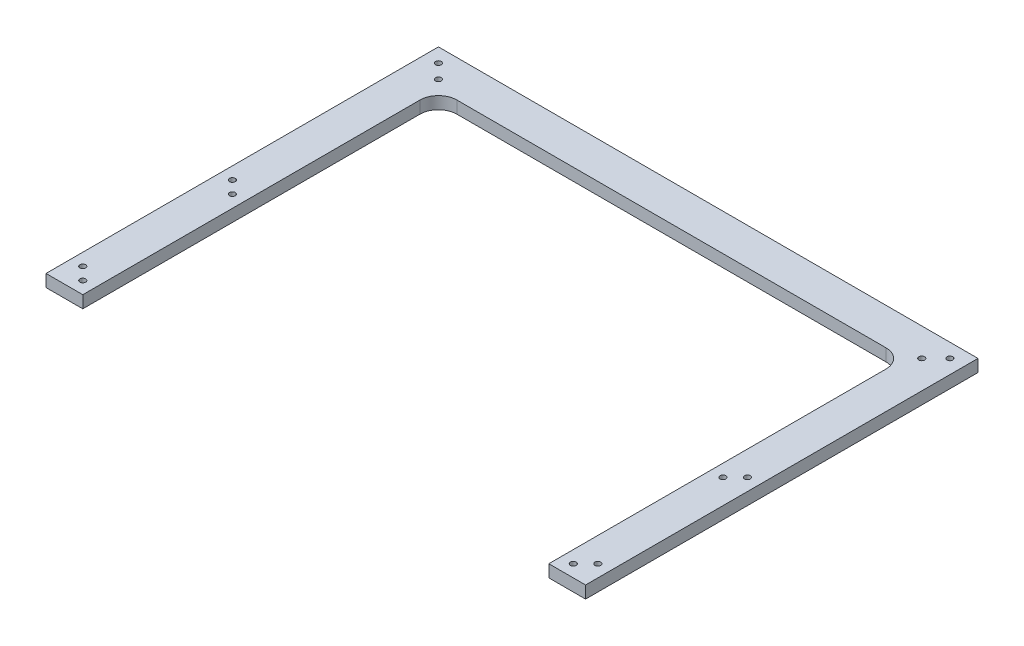
ISO-10303-21;
HEADER;
FILE_DESCRIPTION(('STEP AP214'),'2;1');
FILE_NAME('part.step','',(''),(''),'','','');
FILE_SCHEMA(('AUTOMOTIVE_DESIGN { 1 0 10303 214 1 1 1 1 }'));
ENDSEC;
DATA;
#1=APPLICATION_CONTEXT('core data for automotive mechanical design processes');
#2=APPLICATION_PROTOCOL_DEFINITION('international standard','automotive_design',2000,#1);
#3=PRODUCT_CONTEXT('',#1,'mechanical');
#4=PRODUCT('Part','Part','',(#3));
#5=PRODUCT_RELATED_PRODUCT_CATEGORY('part','',(#4));
#6=PRODUCT_DEFINITION_FORMATION('','',#4);
#7=PRODUCT_DEFINITION_CONTEXT('part definition',#1,'design');
#8=PRODUCT_DEFINITION('design','',#6,#7);
#9=PRODUCT_DEFINITION_SHAPE('','',#8);
#10=(LENGTH_UNIT() NAMED_UNIT(*) SI_UNIT(.MILLI.,.METRE.));
#11=(NAMED_UNIT(*) PLANE_ANGLE_UNIT() SI_UNIT($,.RADIAN.));
#12=(NAMED_UNIT(*) SI_UNIT($,.STERADIAN.) SOLID_ANGLE_UNIT());
#13=UNCERTAINTY_MEASURE_WITH_UNIT(LENGTH_MEASURE(1.E-05),#10,'distance_accuracy_value','');
#14=(GEOMETRIC_REPRESENTATION_CONTEXT(3) GLOBAL_UNCERTAINTY_ASSIGNED_CONTEXT((#13)) GLOBAL_UNIT_ASSIGNED_CONTEXT((#10,
#11,#12)) REPRESENTATION_CONTEXT('',''));
#15=CARTESIAN_POINT('',(0.,0.,0.));
#16=DIRECTION('',(0.,0.,1.));
#17=DIRECTION('',(1.,0.,0.));
#18=AXIS2_PLACEMENT_3D('',#15,#16,#17);
#19=CARTESIAN_POINT('',(-139.7,-6.35,101.6));
#20=DIRECTION('',(0.,0.,1.));
#21=DIRECTION('',(1.,0.,0.));
#22=AXIS2_PLACEMENT_3D('',#19,#20,#21);
#23=PLANE('',#22);
#24=DIRECTION('',(1.,0.,0.));
#25=VECTOR('',#24,1.);
#26=CARTESIAN_POINT('',(-139.7,0.,101.6));
#27=LINE('',#26,#25);
#28=CARTESIAN_POINT('',(-139.7,0.,101.6));
#29=VERTEX_POINT('',#28);
#30=CARTESIAN_POINT('',(-120.65,0.,101.6));
#31=VERTEX_POINT('',#30);
#32=EDGE_CURVE('E167',#29,#31,#27,.T.);
#33=ORIENTED_EDGE('',*,*,#32,.F.);
#34=DIRECTION('',(0.,1.,0.));
#35=VECTOR('',#34,1.);
#36=CARTESIAN_POINT('',(-139.7,-6.35,101.6));
#37=LINE('',#36,#35);
#38=CARTESIAN_POINT('',(-139.7,-6.35,101.6));
#39=VERTEX_POINT('',#38);
#40=EDGE_CURVE('E135',#39,#29,#37,.T.);
#41=ORIENTED_EDGE('',*,*,#40,.F.);
#42=DIRECTION('',(1.,0.,0.));
#43=VECTOR('',#42,1.);
#44=CARTESIAN_POINT('',(-139.7,-6.35,101.6));
#45=LINE('',#44,#43);
#46=CARTESIAN_POINT('',(-120.65,-6.35,101.6));
#47=VERTEX_POINT('',#46);
#48=EDGE_CURVE('E131',#39,#47,#45,.T.);
#49=ORIENTED_EDGE('',*,*,#48,.T.);
#50=DIRECTION('',(0.,1.,0.));
#51=VECTOR('',#50,1.);
#52=CARTESIAN_POINT('',(-120.65,-6.35,101.6));
#53=LINE('',#52,#51);
#54=EDGE_CURVE('E116',#47,#31,#53,.T.);
#55=ORIENTED_EDGE('',*,*,#54,.T.);
#56=EDGE_LOOP('',(#33,#41,#49,#55));
#57=FACE_BOUND('',#56,.T.);
#58=ADVANCED_FACE('F39',(#57),#23,.T.);
#59=CARTESIAN_POINT('',(-139.7,-6.35,101.6));
#60=DIRECTION('',(1.,0.,0.));
#61=DIRECTION('',(0.,0.,-1.));
#62=AXIS2_PLACEMENT_3D('',#59,#60,#61);
#63=PLANE('',#62);
#64=DIRECTION('',(0.,0.,-1.));
#65=VECTOR('',#64,1.);
#66=CARTESIAN_POINT('',(-139.7,0.,101.6));
#67=LINE('',#66,#65);
#68=CARTESIAN_POINT('',(-139.7,0.,-101.6));
#69=VERTEX_POINT('',#68);
#70=EDGE_CURVE('E138',#29,#69,#67,.T.);
#71=ORIENTED_EDGE('',*,*,#70,.T.);
#72=DIRECTION('',(0.,1.,0.));
#73=VECTOR('',#72,1.);
#74=CARTESIAN_POINT('',(-139.7,-6.35,-101.6));
#75=LINE('',#74,#73);
#76=CARTESIAN_POINT('',(-139.7,-6.35,-101.6));
#77=VERTEX_POINT('',#76);
#78=EDGE_CURVE('E195',#77,#69,#75,.T.);
#79=ORIENTED_EDGE('',*,*,#78,.F.);
#80=DIRECTION('',(0.,0.,-1.));
#81=VECTOR('',#80,1.);
#82=CARTESIAN_POINT('',(-139.7,-6.35,101.6));
#83=LINE('',#82,#81);
#84=EDGE_CURVE('E127',#39,#77,#83,.T.);
#85=ORIENTED_EDGE('',*,*,#84,.F.);
#86=ORIENTED_EDGE('',*,*,#40,.T.);
#87=EDGE_LOOP('',(#71,#79,#85,#86));
#88=FACE_BOUND('',#87,.T.);
#89=ADVANCED_FACE('F243',(#88),#63,.F.);
#90=CARTESIAN_POINT('',(-139.7,-6.35,-101.6));
#91=DIRECTION('',(0.,0.,1.));
#92=DIRECTION('',(1.,0.,0.));
#93=AXIS2_PLACEMENT_3D('',#90,#91,#92);
#94=PLANE('',#93);
#95=DIRECTION('',(1.,0.,0.));
#96=VECTOR('',#95,1.);
#97=CARTESIAN_POINT('',(-139.7,0.,-101.6));
#98=LINE('',#97,#96);
#99=CARTESIAN_POINT('',(139.7,0.,-101.6));
#100=VERTEX_POINT('',#99);
#101=EDGE_CURVE('E141',#69,#100,#98,.T.);
#102=ORIENTED_EDGE('',*,*,#101,.T.);
#103=DIRECTION('',(0.,1.,0.));
#104=VECTOR('',#103,1.);
#105=CARTESIAN_POINT('',(139.7,-6.35,-101.6));
#106=LINE('',#105,#104);
#107=CARTESIAN_POINT('',(139.7,-6.35,-101.6));
#108=VERTEX_POINT('',#107);
#109=EDGE_CURVE('E199',#108,#100,#106,.T.);
#110=ORIENTED_EDGE('',*,*,#109,.F.);
#111=DIRECTION('',(1.,0.,0.));
#112=VECTOR('',#111,1.);
#113=CARTESIAN_POINT('',(-139.7,-6.35,-101.6));
#114=LINE('',#113,#112);
#115=EDGE_CURVE('E162',#77,#108,#114,.T.);
#116=ORIENTED_EDGE('',*,*,#115,.F.);
#117=ORIENTED_EDGE('',*,*,#78,.T.);
#118=EDGE_LOOP('',(#102,#110,#116,#117));
#119=FACE_BOUND('',#118,.T.);
#120=ADVANCED_FACE('F248',(#119),#94,.F.);
#121=CARTESIAN_POINT('',(139.7,-6.35,101.6));
#122=DIRECTION('',(1.,0.,0.));
#123=DIRECTION('',(0.,0.,-1.));
#124=AXIS2_PLACEMENT_3D('',#121,#122,#123);
#125=PLANE('',#124);
#126=DIRECTION('',(0.,0.,-1.));
#127=VECTOR('',#126,1.);
#128=CARTESIAN_POINT('',(139.7,0.,101.6));
#129=LINE('',#128,#127);
#130=CARTESIAN_POINT('',(139.7,0.,101.6));
#131=VERTEX_POINT('',#130);
#132=EDGE_CURVE('E185',#131,#100,#129,.T.);
#133=ORIENTED_EDGE('',*,*,#132,.F.);
#134=DIRECTION('',(0.,1.,0.));
#135=VECTOR('',#134,1.);
#136=CARTESIAN_POINT('',(139.7,-6.35,101.6));
#137=LINE('',#136,#135);
#138=CARTESIAN_POINT('',(139.7,-6.35,101.6));
#139=VERTEX_POINT('',#138);
#140=EDGE_CURVE('E202',#139,#131,#137,.T.);
#141=ORIENTED_EDGE('',*,*,#140,.F.);
#142=DIRECTION('',(0.,0.,-1.));
#143=VECTOR('',#142,1.);
#144=CARTESIAN_POINT('',(139.7,-6.35,101.6));
#145=LINE('',#144,#143);
#146=EDGE_CURVE('E158',#139,#108,#145,.T.);
#147=ORIENTED_EDGE('',*,*,#146,.T.);
#148=ORIENTED_EDGE('',*,*,#109,.T.);
#149=EDGE_LOOP('',(#133,#141,#147,#148));
#150=FACE_BOUND('',#149,.T.);
#151=ADVANCED_FACE('F263',(#150),#125,.T.);
#152=CARTESIAN_POINT('',(120.65,-6.35,101.6));
#153=DIRECTION('',(0.,0.,1.));
#154=DIRECTION('',(1.,0.,0.));
#155=AXIS2_PLACEMENT_3D('',#152,#153,#154);
#156=PLANE('',#155);
#157=DIRECTION('',(1.,0.,0.));
#158=VECTOR('',#157,1.);
#159=CARTESIAN_POINT('',(120.65,0.,101.6));
#160=LINE('',#159,#158);
#161=CARTESIAN_POINT('',(120.65,0.,101.6));
#162=VERTEX_POINT('',#161);
#163=EDGE_CURVE('E181',#162,#131,#160,.T.);
#164=ORIENTED_EDGE('',*,*,#163,.F.);
#165=DIRECTION('',(0.,1.,0.));
#166=VECTOR('',#165,1.);
#167=CARTESIAN_POINT('',(120.65,-6.35,101.6));
#168=LINE('',#167,#166);
#169=CARTESIAN_POINT('',(120.65,-6.35,101.6));
#170=VERTEX_POINT('',#169);
#171=EDGE_CURVE('E126',#170,#162,#168,.T.);
#172=ORIENTED_EDGE('',*,*,#171,.F.);
#173=DIRECTION('',(1.,0.,0.));
#174=VECTOR('',#173,1.);
#175=CARTESIAN_POINT('',(120.65,-6.35,101.6));
#176=LINE('',#175,#174);
#177=EDGE_CURVE('E154',#170,#139,#176,.T.);
#178=ORIENTED_EDGE('',*,*,#177,.T.);
#179=ORIENTED_EDGE('',*,*,#140,.T.);
#180=EDGE_LOOP('',(#164,#172,#178,#179));
#181=FACE_BOUND('',#180,.T.);
#182=ADVANCED_FACE('F259',(#181),#156,.T.);
#183=CARTESIAN_POINT('',(120.65,-6.35,101.6));
#184=DIRECTION('',(1.,0.,0.));
#185=DIRECTION('',(0.,0.,-1.));
#186=AXIS2_PLACEMENT_3D('',#183,#184,#185);
#187=PLANE('',#186);
#188=DIRECTION('',(0.,0.,-1.));
#189=VECTOR('',#188,1.);
#190=CARTESIAN_POINT('',(120.65,0.,101.6));
#191=LINE('',#190,#189);
#192=CARTESIAN_POINT('',(120.65,0.,-73.025));
#193=VERTEX_POINT('',#192);
#194=EDGE_CURVE('E177',#162,#193,#191,.T.);
#195=ORIENTED_EDGE('',*,*,#194,.T.);
#196=DIRECTION('',(0.,1.,0.));
#197=VECTOR('',#196,1.);
#198=CARTESIAN_POINT('',(120.65,-6.35,-73.025));
#199=LINE('',#198,#197);
#200=CARTESIAN_POINT('',(120.65,-6.35,-73.025));
#201=VERTEX_POINT('',#200);
#202=EDGE_CURVE('E213',#193,#201,#199,.F.);
#203=ORIENTED_EDGE('',*,*,#202,.T.);
#204=DIRECTION('',(0.,0.,-1.));
#205=VECTOR('',#204,1.);
#206=CARTESIAN_POINT('',(120.65,-6.35,101.6));
#207=LINE('',#206,#205);
#208=EDGE_CURVE('E150',#170,#201,#207,.T.);
#209=ORIENTED_EDGE('',*,*,#208,.F.);
#210=ORIENTED_EDGE('',*,*,#171,.T.);
#211=EDGE_LOOP('',(#195,#203,#209,#210));
#212=FACE_BOUND('',#211,.T.);
#213=ADVANCED_FACE('F256',(#212),#187,.F.);
#214=CARTESIAN_POINT('',(-120.65,-6.35,-82.55));
#215=DIRECTION('',(0.,0.,1.));
#216=DIRECTION('',(1.,0.,0.));
#217=AXIS2_PLACEMENT_3D('',#214,#215,#216);
#218=PLANE('',#217);
#219=DIRECTION('',(1.,0.,0.));
#220=VECTOR('',#219,1.);
#221=CARTESIAN_POINT('',(-120.65,-6.35,-82.55));
#222=LINE('',#221,#220);
#223=CARTESIAN_POINT('',(-111.125,-6.35,-82.55));
#224=VERTEX_POINT('',#223);
#225=CARTESIAN_POINT('',(111.125,-6.35,-82.55));
#226=VERTEX_POINT('',#225);
#227=EDGE_CURVE('E133',#224,#226,#222,.T.);
#228=ORIENTED_EDGE('',*,*,#227,.T.);
#229=DIRECTION('',(0.,1.,0.));
#230=VECTOR('',#229,1.);
#231=CARTESIAN_POINT('',(111.125,-6.35,-82.55));
#232=LINE('',#231,#230);
#233=CARTESIAN_POINT('',(111.125,0.,-82.55));
#234=VERTEX_POINT('',#233);
#235=EDGE_CURVE('E209',#226,#234,#232,.T.);
#236=ORIENTED_EDGE('',*,*,#235,.T.);
#237=DIRECTION('',(1.,0.,0.));
#238=VECTOR('',#237,1.);
#239=CARTESIAN_POINT('',(-120.65,0.,-82.55));
#240=LINE('',#239,#238);
#241=CARTESIAN_POINT('',(-111.125,0.,-82.55));
#242=VERTEX_POINT('',#241);
#243=EDGE_CURVE('E173',#242,#234,#240,.T.);
#244=ORIENTED_EDGE('',*,*,#243,.F.);
#245=DIRECTION('',(0.,1.,0.));
#246=VECTOR('',#245,1.);
#247=CARTESIAN_POINT('',(-111.125,-6.35,-82.55));
#248=LINE('',#247,#246);
#249=EDGE_CURVE('E194',#242,#224,#248,.F.);
#250=ORIENTED_EDGE('',*,*,#249,.T.);
#251=EDGE_LOOP('',(#228,#236,#244,#250));
#252=FACE_BOUND('',#251,.T.);
#253=ADVANCED_FACE('F229',(#252),#218,.T.);
#254=CARTESIAN_POINT('',(-120.65,-6.35,101.6));
#255=DIRECTION('',(1.,0.,0.));
#256=DIRECTION('',(0.,0.,-1.));
#257=AXIS2_PLACEMENT_3D('',#254,#255,#256);
#258=PLANE('',#257);
#259=DIRECTION('',(0.,0.,-1.));
#260=VECTOR('',#259,1.);
#261=CARTESIAN_POINT('',(-120.65,-6.35,101.6));
#262=LINE('',#261,#260);
#263=CARTESIAN_POINT('',(-120.65,-6.35,-73.025));
#264=VERTEX_POINT('',#263);
#265=EDGE_CURVE('E118',#47,#264,#262,.T.);
#266=ORIENTED_EDGE('',*,*,#265,.T.);
#267=DIRECTION('',(0.,1.,0.));
#268=VECTOR('',#267,1.);
#269=CARTESIAN_POINT('',(-120.65,0.,-73.025));
#270=LINE('',#269,#268);
#271=CARTESIAN_POINT('',(-120.65,0.,-73.025));
#272=VERTEX_POINT('',#271);
#273=EDGE_CURVE('E216',#264,#272,#270,.T.);
#274=ORIENTED_EDGE('',*,*,#273,.T.);
#275=DIRECTION('',(0.,0.,-1.));
#276=VECTOR('',#275,1.);
#277=CARTESIAN_POINT('',(-120.65,0.,101.6));
#278=LINE('',#277,#276);
#279=EDGE_CURVE('E120',#31,#272,#278,.T.);
#280=ORIENTED_EDGE('',*,*,#279,.F.);
#281=ORIENTED_EDGE('',*,*,#54,.F.);
#282=EDGE_LOOP('',(#266,#274,#280,#281));
#283=FACE_BOUND('',#282,.T.);
#284=ADVANCED_FACE('F117',(#283),#258,.T.);
#285=CARTESIAN_POINT('',(0.,-6.35,0.));
#286=DIRECTION('',(0.,1.,0.));
#287=DIRECTION('',(0.,0.,1.));
#288=AXIS2_PLACEMENT_3D('',#285,#286,#287);
#289=PLANE('',#288);
#290=CARTESIAN_POINT('',(127.,-6.35,17.7799999999999));
#291=DIRECTION('',(0.,1.,0.));
#292=DIRECTION('',(0.,0.,-1.));
#293=AXIS2_PLACEMENT_3D('',#290,#291,#292);
#294=CIRCLE('',#293,1.5);
#295=CARTESIAN_POINT('',(127.,-6.35,16.2799999999999));
#296=VERTEX_POINT('',#295);
#297=EDGE_CURVE('E324',#296,#296,#294,.T.);
#298=ORIENTED_EDGE('',*,*,#297,.T.);
#299=EDGE_LOOP('',(#298));
#300=FACE_BOUND('',#299,.T.);
#301=CARTESIAN_POINT('',(133.35,-6.35,11.4299999999999));
#302=DIRECTION('',(0.,1.,0.));
#303=DIRECTION('',(0.,0.,-1.));
#304=AXIS2_PLACEMENT_3D('',#301,#302,#303);
#305=CIRCLE('',#304,1.5);
#306=CARTESIAN_POINT('',(133.35,-6.35,9.9299999999999));
#307=VERTEX_POINT('',#306);
#308=EDGE_CURVE('E343',#307,#307,#305,.T.);
#309=ORIENTED_EDGE('',*,*,#308,.T.);
#310=EDGE_LOOP('',(#309));
#311=FACE_BOUND('',#310,.T.);
#312=CARTESIAN_POINT('',(-127.,-6.35,17.78));
#313=DIRECTION('',(0.,1.,0.));
#314=DIRECTION('',(0.,0.,1.));
#315=AXIS2_PLACEMENT_3D('',#312,#313,#314);
#316=CIRCLE('',#315,1.5);
#317=CARTESIAN_POINT('',(-127.,-6.35,19.28));
#318=VERTEX_POINT('',#317);
#319=EDGE_CURVE('E334',#318,#318,#316,.T.);
#320=ORIENTED_EDGE('',*,*,#319,.T.);
#321=EDGE_LOOP('',(#320));
#322=FACE_BOUND('',#321,.T.);
#323=CARTESIAN_POINT('',(-133.35,-6.35,11.43));
#324=DIRECTION('',(0.,1.,0.));
#325=DIRECTION('',(0.,0.,1.));
#326=AXIS2_PLACEMENT_3D('',#323,#324,#325);
#327=CIRCLE('',#326,1.5);
#328=CARTESIAN_POINT('',(-133.35,-6.35,12.93));
#329=VERTEX_POINT('',#328);
#330=EDGE_CURVE('E350',#329,#329,#327,.T.);
#331=ORIENTED_EDGE('',*,*,#330,.T.);
#332=EDGE_LOOP('',(#331));
#333=FACE_BOUND('',#332,.T.);
#334=CARTESIAN_POINT('',(132.420064030267,-6.35,-94.3200640302673));
#335=DIRECTION('',(0.,1.,0.));
#336=DIRECTION('',(0.,0.,1.));
#337=AXIS2_PLACEMENT_3D('',#334,#335,#336);
#338=CIRCLE('',#337,1.5);
#339=CARTESIAN_POINT('',(132.420064030267,-6.35,-92.8200640302673));
#340=VERTEX_POINT('',#339);
#341=EDGE_CURVE('E391',#340,#340,#338,.T.);
#342=ORIENTED_EDGE('',*,*,#341,.T.);
#343=EDGE_LOOP('',(#342));
#344=FACE_BOUND('',#343,.T.);
#345=CARTESIAN_POINT('',(127.,-6.35,95.2499999999999));
#346=DIRECTION('',(0.,1.,0.));
#347=DIRECTION('',(0.,0.,-1.));
#348=AXIS2_PLACEMENT_3D('',#345,#346,#347);
#349=CIRCLE('',#348,1.5);
#350=CARTESIAN_POINT('',(127.,-6.35,93.7499999999999));
#351=VERTEX_POINT('',#350);
#352=EDGE_CURVE('E382',#351,#351,#349,.T.);
#353=ORIENTED_EDGE('',*,*,#352,.T.);
#354=EDGE_LOOP('',(#353));
#355=FACE_BOUND('',#354,.T.);
#356=CARTESIAN_POINT('',(133.35,-6.35,88.8999999999999));
#357=DIRECTION('',(0.,1.,0.));
#358=DIRECTION('',(0.,0.,-1.));
#359=AXIS2_PLACEMENT_3D('',#356,#357,#358);
#360=CIRCLE('',#359,1.5);
#361=CARTESIAN_POINT('',(133.35,-6.35,87.3999999999999));
#362=VERTEX_POINT('',#361);
#363=EDGE_CURVE('E406',#362,#362,#360,.T.);
#364=ORIENTED_EDGE('',*,*,#363,.T.);
#365=EDGE_LOOP('',(#364));
#366=FACE_BOUND('',#365,.T.);
#367=CARTESIAN_POINT('',(-127.,-6.35,95.25));
#368=DIRECTION('',(0.,1.,0.));
#369=DIRECTION('',(0.,0.,1.));
#370=AXIS2_PLACEMENT_3D('',#367,#368,#369);
#371=CIRCLE('',#370,1.5);
#372=CARTESIAN_POINT('',(-127.,-6.35,96.75));
#373=VERTEX_POINT('',#372);
#374=EDGE_CURVE('E398',#373,#373,#371,.T.);
#375=ORIENTED_EDGE('',*,*,#374,.T.);
#376=EDGE_LOOP('',(#375));
#377=FACE_BOUND('',#376,.T.);
#378=CARTESIAN_POINT('',(125.140128060535,-6.35,-87.0401280605346));
#379=DIRECTION('',(0.,1.,0.));
#380=DIRECTION('',(0.,0.,1.));
#381=AXIS2_PLACEMENT_3D('',#378,#379,#380);
#382=CIRCLE('',#381,1.5);
#383=CARTESIAN_POINT('',(125.140128060535,-6.35,-85.5401280605346));
#384=VERTEX_POINT('',#383);
#385=EDGE_CURVE('E358',#384,#384,#382,.T.);
#386=ORIENTED_EDGE('',*,*,#385,.T.);
#387=EDGE_LOOP('',(#386));
#388=FACE_BOUND('',#387,.T.);
#389=CARTESIAN_POINT('',(-125.140128060535,-6.35,-87.0401280605345));
#390=DIRECTION('',(0.,1.,0.));
#391=DIRECTION('',(0.,0.,-1.));
#392=AXIS2_PLACEMENT_3D('',#389,#390,#391);
#393=CIRCLE('',#392,1.5);
#394=CARTESIAN_POINT('',(-125.140128060535,-6.35,-88.5401280605345));
#395=VERTEX_POINT('',#394);
#396=EDGE_CURVE('E367',#395,#395,#393,.T.);
#397=ORIENTED_EDGE('',*,*,#396,.T.);
#398=EDGE_LOOP('',(#397));
#399=FACE_BOUND('',#398,.T.);
#400=CARTESIAN_POINT('',(-132.420064030267,-6.35,-94.3200640302672));
#401=DIRECTION('',(0.,1.,0.));
#402=DIRECTION('',(0.,0.,-1.));
#403=AXIS2_PLACEMENT_3D('',#400,#401,#402);
#404=CIRCLE('',#403,1.5);
#405=CARTESIAN_POINT('',(-132.420064030267,-6.35,-95.8200640302672));
#406=VERTEX_POINT('',#405);
#407=EDGE_CURVE('E375',#406,#406,#404,.T.);
#408=ORIENTED_EDGE('',*,*,#407,.T.);
#409=EDGE_LOOP('',(#408));
#410=FACE_BOUND('',#409,.T.);
#411=CARTESIAN_POINT('',(-133.35,-6.35,88.9));
#412=DIRECTION('',(0.,1.,0.));
#413=DIRECTION('',(0.,0.,1.));
#414=AXIS2_PLACEMENT_3D('',#411,#412,#413);
#415=CIRCLE('',#414,1.5);
#416=CARTESIAN_POINT('',(-133.35,-6.35,90.4));
#417=VERTEX_POINT('',#416);
#418=EDGE_CURVE('E170',#417,#417,#415,.T.);
#419=ORIENTED_EDGE('',*,*,#418,.T.);
#420=EDGE_LOOP('',(#419));
#421=FACE_BOUND('',#420,.T.);
#422=ORIENTED_EDGE('',*,*,#48,.F.);
#423=ORIENTED_EDGE('',*,*,#84,.T.);
#424=ORIENTED_EDGE('',*,*,#115,.T.);
#425=ORIENTED_EDGE('',*,*,#146,.F.);
#426=ORIENTED_EDGE('',*,*,#177,.F.);
#427=ORIENTED_EDGE('',*,*,#208,.T.);
#428=CARTESIAN_POINT('',(111.125,-6.35,-73.025));
#429=DIRECTION('',(0.,1.,0.));
#430=DIRECTION('',(0.,0.,1.));
#431=AXIS2_PLACEMENT_3D('',#428,#429,#430);
#432=CIRCLE('',#431,9.525);
#433=EDGE_CURVE('E222',#201,#226,#432,.T.);
#434=ORIENTED_EDGE('',*,*,#433,.T.);
#435=ORIENTED_EDGE('',*,*,#227,.F.);
#436=CARTESIAN_POINT('',(-111.125,-6.35,-73.025));
#437=DIRECTION('',(0.,1.,0.));
#438=DIRECTION('',(0.,0.,1.));
#439=AXIS2_PLACEMENT_3D('',#436,#437,#438);
#440=CIRCLE('',#439,9.525);
#441=EDGE_CURVE('E11',#224,#264,#440,.T.);
#442=ORIENTED_EDGE('',*,*,#441,.T.);
#443=ORIENTED_EDGE('',*,*,#265,.F.);
#444=EDGE_LOOP('',(#422,#423,#424,#425,#426,#427,#434,#435,#442,#443));
#445=FACE_BOUND('',#444,.T.);
#446=ADVANCED_FACE('F130',(#300,#311,#322,#333,#344,#355,#366,#377,#388,#399,#410,#421,#445),
#289,.F.);
#447=CARTESIAN_POINT('',(0.,0.,0.));
#448=DIRECTION('',(0.,1.,0.));
#449=DIRECTION('',(0.,0.,1.));
#450=AXIS2_PLACEMENT_3D('',#447,#448,#449);
#451=PLANE('',#450);
#452=CARTESIAN_POINT('',(127.,0.,17.7799999999999));
#453=DIRECTION('',(0.,1.,0.));
#454=DIRECTION('',(0.,0.,-1.));
#455=AXIS2_PLACEMENT_3D('',#452,#453,#454);
#456=CIRCLE('',#455,1.5);
#457=CARTESIAN_POINT('',(127.,0.,16.2799999999999));
#458=VERTEX_POINT('',#457);
#459=EDGE_CURVE('E327',#458,#458,#456,.T.);
#460=ORIENTED_EDGE('',*,*,#459,.F.);
#461=EDGE_LOOP('',(#460));
#462=FACE_BOUND('',#461,.T.);
#463=CARTESIAN_POINT('',(133.35,0.,11.4299999999999));
#464=DIRECTION('',(0.,1.,0.));
#465=DIRECTION('',(0.,0.,-1.));
#466=AXIS2_PLACEMENT_3D('',#463,#464,#465);
#467=CIRCLE('',#466,1.5);
#468=CARTESIAN_POINT('',(133.35,0.,9.9299999999999));
#469=VERTEX_POINT('',#468);
#470=EDGE_CURVE('E331',#469,#469,#467,.T.);
#471=ORIENTED_EDGE('',*,*,#470,.F.);
#472=EDGE_LOOP('',(#471));
#473=FACE_BOUND('',#472,.T.);
#474=CARTESIAN_POINT('',(-127.,0.,17.78));
#475=DIRECTION('',(0.,1.,0.));
#476=DIRECTION('',(0.,0.,1.));
#477=AXIS2_PLACEMENT_3D('',#474,#475,#476);
#478=CIRCLE('',#477,1.5);
#479=CARTESIAN_POINT('',(-127.,0.,19.28));
#480=VERTEX_POINT('',#479);
#481=EDGE_CURVE('E339',#480,#480,#478,.T.);
#482=ORIENTED_EDGE('',*,*,#481,.F.);
#483=EDGE_LOOP('',(#482));
#484=FACE_BOUND('',#483,.T.);
#485=CARTESIAN_POINT('',(-133.35,0.,11.43));
#486=DIRECTION('',(0.,1.,0.));
#487=DIRECTION('',(0.,0.,1.));
#488=AXIS2_PLACEMENT_3D('',#485,#486,#487);
#489=CIRCLE('',#488,1.5);
#490=CARTESIAN_POINT('',(-133.35,0.,12.93));
#491=VERTEX_POINT('',#490);
#492=EDGE_CURVE('E338',#491,#491,#489,.T.);
#493=ORIENTED_EDGE('',*,*,#492,.F.);
#494=EDGE_LOOP('',(#493));
#495=FACE_BOUND('',#494,.T.);
#496=CARTESIAN_POINT('',(132.420064030267,0.,-94.3200640302673));
#497=DIRECTION('',(0.,1.,0.));
#498=DIRECTION('',(0.,0.,1.));
#499=AXIS2_PLACEMENT_3D('',#496,#497,#498);
#500=CIRCLE('',#499,1.5);
#501=CARTESIAN_POINT('',(132.420064030267,0.,-92.8200640302673));
#502=VERTEX_POINT('',#501);
#503=EDGE_CURVE('E362',#502,#502,#500,.T.);
#504=ORIENTED_EDGE('',*,*,#503,.F.);
#505=EDGE_LOOP('',(#504));
#506=FACE_BOUND('',#505,.T.);
#507=CARTESIAN_POINT('',(127.,0.,95.2499999999999));
#508=DIRECTION('',(0.,1.,0.));
#509=DIRECTION('',(0.,0.,-1.));
#510=AXIS2_PLACEMENT_3D('',#507,#508,#509);
#511=CIRCLE('',#510,1.5);
#512=CARTESIAN_POINT('',(127.,0.,93.7499999999999));
#513=VERTEX_POINT('',#512);
#514=EDGE_CURVE('E387',#513,#513,#511,.T.);
#515=ORIENTED_EDGE('',*,*,#514,.F.);
#516=EDGE_LOOP('',(#515));
#517=FACE_BOUND('',#516,.T.);
#518=CARTESIAN_POINT('',(133.35,0.,88.8999999999999));
#519=DIRECTION('',(0.,1.,0.));
#520=DIRECTION('',(0.,0.,-1.));
#521=AXIS2_PLACEMENT_3D('',#518,#519,#520);
#522=CIRCLE('',#521,1.5);
#523=CARTESIAN_POINT('',(133.35,0.,87.3999999999999));
#524=VERTEX_POINT('',#523);
#525=EDGE_CURVE('E386',#524,#524,#522,.T.);
#526=ORIENTED_EDGE('',*,*,#525,.F.);
#527=EDGE_LOOP('',(#526));
#528=FACE_BOUND('',#527,.T.);
#529=CARTESIAN_POINT('',(-127.,0.,95.25));
#530=DIRECTION('',(0.,1.,0.));
#531=DIRECTION('',(0.,0.,1.));
#532=AXIS2_PLACEMENT_3D('',#529,#530,#531);
#533=CIRCLE('',#532,1.5);
#534=CARTESIAN_POINT('',(-127.,0.,96.75));
#535=VERTEX_POINT('',#534);
#536=EDGE_CURVE('E402',#535,#535,#533,.T.);
#537=ORIENTED_EDGE('',*,*,#536,.F.);
#538=EDGE_LOOP('',(#537));
#539=FACE_BOUND('',#538,.T.);
#540=CARTESIAN_POINT('',(125.140128060535,0.,-87.0401280605346));
#541=DIRECTION('',(0.,1.,0.));
#542=DIRECTION('',(0.,0.,1.));
#543=AXIS2_PLACEMENT_3D('',#540,#541,#542);
#544=CIRCLE('',#543,1.5);
#545=CARTESIAN_POINT('',(125.140128060535,0.,-85.5401280605346));
#546=VERTEX_POINT('',#545);
#547=EDGE_CURVE('E363',#546,#546,#544,.T.);
#548=ORIENTED_EDGE('',*,*,#547,.F.);
#549=EDGE_LOOP('',(#548));
#550=FACE_BOUND('',#549,.T.);
#551=CARTESIAN_POINT('',(-125.140128060535,0.,-87.0401280605345));
#552=DIRECTION('',(0.,1.,0.));
#553=DIRECTION('',(0.,0.,-1.));
#554=AXIS2_PLACEMENT_3D('',#551,#552,#553);
#555=CIRCLE('',#554,1.5);
#556=CARTESIAN_POINT('',(-125.140128060535,0.,-88.5401280605345));
#557=VERTEX_POINT('',#556);
#558=EDGE_CURVE('E371',#557,#557,#555,.T.);
#559=ORIENTED_EDGE('',*,*,#558,.F.);
#560=EDGE_LOOP('',(#559));
#561=FACE_BOUND('',#560,.T.);
#562=CARTESIAN_POINT('',(-132.420064030267,0.,-94.3200640302672));
#563=DIRECTION('',(0.,1.,0.));
#564=DIRECTION('',(0.,0.,-1.));
#565=AXIS2_PLACEMENT_3D('',#562,#563,#564);
#566=CIRCLE('',#565,1.5);
#567=CARTESIAN_POINT('',(-132.420064030267,0.,-95.8200640302672));
#568=VERTEX_POINT('',#567);
#569=EDGE_CURVE('E354',#568,#568,#566,.T.);
#570=ORIENTED_EDGE('',*,*,#569,.F.);
#571=EDGE_LOOP('',(#570));
#572=FACE_BOUND('',#571,.T.);
#573=CARTESIAN_POINT('',(-133.35,0.,88.9));
#574=DIRECTION('',(0.,1.,0.));
#575=DIRECTION('',(0.,0.,1.));
#576=AXIS2_PLACEMENT_3D('',#573,#574,#575);
#577=CIRCLE('',#576,1.5);
#578=CARTESIAN_POINT('',(-133.35,0.,90.4));
#579=VERTEX_POINT('',#578);
#580=EDGE_CURVE('E144',#579,#579,#577,.T.);
#581=ORIENTED_EDGE('',*,*,#580,.F.);
#582=EDGE_LOOP('',(#581));
#583=FACE_BOUND('',#582,.T.);
#584=ORIENTED_EDGE('',*,*,#32,.T.);
#585=ORIENTED_EDGE('',*,*,#279,.T.);
#586=CARTESIAN_POINT('',(-111.125,0.,-73.025));
#587=DIRECTION('',(0.,1.,0.));
#588=DIRECTION('',(0.,0.,1.));
#589=AXIS2_PLACEMENT_3D('',#586,#587,#588);
#590=CIRCLE('',#589,9.525);
#591=EDGE_CURVE('E48',#272,#242,#590,.F.);
#592=ORIENTED_EDGE('',*,*,#591,.T.);
#593=ORIENTED_EDGE('',*,*,#243,.T.);
#594=CARTESIAN_POINT('',(111.125,0.,-73.025));
#595=DIRECTION('',(0.,1.,0.));
#596=DIRECTION('',(0.,0.,1.));
#597=AXIS2_PLACEMENT_3D('',#594,#595,#596);
#598=CIRCLE('',#597,9.525);
#599=EDGE_CURVE('E219',#234,#193,#598,.F.);
#600=ORIENTED_EDGE('',*,*,#599,.T.);
#601=ORIENTED_EDGE('',*,*,#194,.F.);
#602=ORIENTED_EDGE('',*,*,#163,.T.);
#603=ORIENTED_EDGE('',*,*,#132,.T.);
#604=ORIENTED_EDGE('',*,*,#101,.F.);
#605=ORIENTED_EDGE('',*,*,#70,.F.);
#606=EDGE_LOOP('',(#584,#585,#592,#593,#600,#601,#602,#603,#604,#605));
#607=FACE_BOUND('',#606,.T.);
#608=ADVANCED_FACE('F227',(#462,#473,#484,#495,#506,#517,#528,#539,#550,#561,#572,#583,#607),
#451,.T.);
#609=CARTESIAN_POINT('',(111.125,-6.35,-73.025));
#610=DIRECTION('',(0.,1.,0.));
#611=DIRECTION('',(0.,0.,1.));
#612=AXIS2_PLACEMENT_3D('',#609,#610,#611);
#613=CYLINDRICAL_SURFACE('',#612,9.525);
#614=ORIENTED_EDGE('',*,*,#433,.F.);
#615=ORIENTED_EDGE('',*,*,#202,.F.);
#616=ORIENTED_EDGE('',*,*,#599,.F.);
#617=ORIENTED_EDGE('',*,*,#235,.F.);
#618=EDGE_LOOP('',(#614,#615,#616,#617));
#619=FACE_BOUND('',#618,.T.);
#620=ADVANCED_FACE('F233',(#619),#613,.F.);
#621=CARTESIAN_POINT('',(-111.125,-6.35,-73.025));
#622=DIRECTION('',(0.,-1.,0.));
#623=DIRECTION('',(0.,0.,-1.));
#624=AXIS2_PLACEMENT_3D('',#621,#622,#623);
#625=CYLINDRICAL_SURFACE('',#624,9.525);
#626=ORIENTED_EDGE('',*,*,#441,.F.);
#627=ORIENTED_EDGE('',*,*,#249,.F.);
#628=ORIENTED_EDGE('',*,*,#591,.F.);
#629=ORIENTED_EDGE('',*,*,#273,.F.);
#630=EDGE_LOOP('',(#626,#627,#628,#629));
#631=FACE_BOUND('',#630,.T.);
#632=ADVANCED_FACE('F41',(#631),#625,.F.);
#633=CARTESIAN_POINT('',(-133.35,-6.35,88.9));
#634=DIRECTION('',(0.,1.,0.));
#635=DIRECTION('',(0.,0.,1.));
#636=AXIS2_PLACEMENT_3D('',#633,#634,#635);
#637=CYLINDRICAL_SURFACE('',#636,1.5);
#638=ORIENTED_EDGE('',*,*,#418,.F.);
#639=EDGE_LOOP('',(#638));
#640=FACE_BOUND('',#639,.T.);
#641=ORIENTED_EDGE('',*,*,#580,.T.);
#642=EDGE_LOOP('',(#641));
#643=FACE_BOUND('',#642,.T.);
#644=ADVANCED_FACE('F232',(#640,#643),#637,.F.);
#645=CARTESIAN_POINT('',(-132.420064030267,-6.35,-94.3200640302672));
#646=DIRECTION('',(0.,1.,0.));
#647=DIRECTION('',(0.,0.,1.));
#648=AXIS2_PLACEMENT_3D('',#645,#646,#647);
#649=CYLINDRICAL_SURFACE('',#648,1.5);
#650=ORIENTED_EDGE('',*,*,#407,.F.);
#651=EDGE_LOOP('',(#650));
#652=FACE_BOUND('',#651,.T.);
#653=ORIENTED_EDGE('',*,*,#569,.T.);
#654=EDGE_LOOP('',(#653));
#655=FACE_BOUND('',#654,.T.);
#656=ADVANCED_FACE('F238',(#652,#655),#649,.F.);
#657=CARTESIAN_POINT('',(-125.140128060535,-6.35,-87.0401280605345));
#658=DIRECTION('',(0.,1.,0.));
#659=DIRECTION('',(0.,0.,1.));
#660=AXIS2_PLACEMENT_3D('',#657,#658,#659);
#661=CYLINDRICAL_SURFACE('',#660,1.5);
#662=ORIENTED_EDGE('',*,*,#396,.F.);
#663=EDGE_LOOP('',(#662));
#664=FACE_BOUND('',#663,.T.);
#665=ORIENTED_EDGE('',*,*,#558,.T.);
#666=EDGE_LOOP('',(#665));
#667=FACE_BOUND('',#666,.T.);
#668=ADVANCED_FACE('F297',(#664,#667),#661,.F.);
#669=CARTESIAN_POINT('',(125.140128060535,-6.35,-87.0401280605346));
#670=DIRECTION('',(0.,1.,0.));
#671=DIRECTION('',(0.,0.,1.));
#672=AXIS2_PLACEMENT_3D('',#669,#670,#671);
#673=CYLINDRICAL_SURFACE('',#672,1.5);
#674=ORIENTED_EDGE('',*,*,#385,.F.);
#675=EDGE_LOOP('',(#674));
#676=FACE_BOUND('',#675,.T.);
#677=ORIENTED_EDGE('',*,*,#547,.T.);
#678=EDGE_LOOP('',(#677));
#679=FACE_BOUND('',#678,.T.);
#680=ADVANCED_FACE('F285',(#676,#679),#673,.F.);
#681=CARTESIAN_POINT('',(-127.,-6.35,95.25));
#682=DIRECTION('',(0.,1.,0.));
#683=DIRECTION('',(0.,0.,1.));
#684=AXIS2_PLACEMENT_3D('',#681,#682,#683);
#685=CYLINDRICAL_SURFACE('',#684,1.5);
#686=ORIENTED_EDGE('',*,*,#374,.F.);
#687=EDGE_LOOP('',(#686));
#688=FACE_BOUND('',#687,.T.);
#689=ORIENTED_EDGE('',*,*,#536,.T.);
#690=EDGE_LOOP('',(#689));
#691=FACE_BOUND('',#690,.T.);
#692=ADVANCED_FACE('F281',(#688,#691),#685,.F.);
#693=CARTESIAN_POINT('',(133.35,-6.35,88.8999999999999));
#694=DIRECTION('',(0.,1.,0.));
#695=DIRECTION('',(0.,0.,1.));
#696=AXIS2_PLACEMENT_3D('',#693,#694,#695);
#697=CYLINDRICAL_SURFACE('',#696,1.5);
#698=ORIENTED_EDGE('',*,*,#363,.F.);
#699=EDGE_LOOP('',(#698));
#700=FACE_BOUND('',#699,.T.);
#701=ORIENTED_EDGE('',*,*,#525,.T.);
#702=EDGE_LOOP('',(#701));
#703=FACE_BOUND('',#702,.T.);
#704=ADVANCED_FACE('F277',(#700,#703),#697,.F.);
#705=CARTESIAN_POINT('',(127.,-6.35,95.2499999999999));
#706=DIRECTION('',(0.,1.,0.));
#707=DIRECTION('',(0.,0.,1.));
#708=AXIS2_PLACEMENT_3D('',#705,#706,#707);
#709=CYLINDRICAL_SURFACE('',#708,1.5);
#710=ORIENTED_EDGE('',*,*,#352,.F.);
#711=EDGE_LOOP('',(#710));
#712=FACE_BOUND('',#711,.T.);
#713=ORIENTED_EDGE('',*,*,#514,.T.);
#714=EDGE_LOOP('',(#713));
#715=FACE_BOUND('',#714,.T.);
#716=ADVANCED_FACE('F280',(#712,#715),#709,.F.);
#717=CARTESIAN_POINT('',(132.420064030267,-6.35,-94.3200640302673));
#718=DIRECTION('',(0.,1.,0.));
#719=DIRECTION('',(0.,0.,1.));
#720=AXIS2_PLACEMENT_3D('',#717,#718,#719);
#721=CYLINDRICAL_SURFACE('',#720,1.5);
#722=ORIENTED_EDGE('',*,*,#341,.F.);
#723=EDGE_LOOP('',(#722));
#724=FACE_BOUND('',#723,.T.);
#725=ORIENTED_EDGE('',*,*,#503,.T.);
#726=EDGE_LOOP('',(#725));
#727=FACE_BOUND('',#726,.T.);
#728=ADVANCED_FACE('F287',(#724,#727),#721,.F.);
#729=CARTESIAN_POINT('',(-133.35,-6.35,11.43));
#730=DIRECTION('',(0.,1.,0.));
#731=DIRECTION('',(0.,0.,1.));
#732=AXIS2_PLACEMENT_3D('',#729,#730,#731);
#733=CYLINDRICAL_SURFACE('',#732,1.5);
#734=ORIENTED_EDGE('',*,*,#330,.F.);
#735=EDGE_LOOP('',(#734));
#736=FACE_BOUND('',#735,.T.);
#737=ORIENTED_EDGE('',*,*,#492,.T.);
#738=EDGE_LOOP('',(#737));
#739=FACE_BOUND('',#738,.T.);
#740=ADVANCED_FACE('F290',(#736,#739),#733,.F.);
#741=CARTESIAN_POINT('',(-127.,-6.35,17.78));
#742=DIRECTION('',(0.,1.,0.));
#743=DIRECTION('',(0.,0.,1.));
#744=AXIS2_PLACEMENT_3D('',#741,#742,#743);
#745=CYLINDRICAL_SURFACE('',#744,1.5);
#746=ORIENTED_EDGE('',*,*,#319,.F.);
#747=EDGE_LOOP('',(#746));
#748=FACE_BOUND('',#747,.T.);
#749=ORIENTED_EDGE('',*,*,#481,.T.);
#750=EDGE_LOOP('',(#749));
#751=FACE_BOUND('',#750,.T.);
#752=ADVANCED_FACE('F307',(#748,#751),#745,.F.);
#753=CARTESIAN_POINT('',(133.35,-6.35,11.4299999999999));
#754=DIRECTION('',(0.,1.,0.));
#755=DIRECTION('',(0.,0.,1.));
#756=AXIS2_PLACEMENT_3D('',#753,#754,#755);
#757=CYLINDRICAL_SURFACE('',#756,1.5);
#758=ORIENTED_EDGE('',*,*,#308,.F.);
#759=EDGE_LOOP('',(#758));
#760=FACE_BOUND('',#759,.T.);
#761=ORIENTED_EDGE('',*,*,#470,.T.);
#762=EDGE_LOOP('',(#761));
#763=FACE_BOUND('',#762,.T.);
#764=ADVANCED_FACE('F309',(#760,#763),#757,.F.);
#765=CARTESIAN_POINT('',(127.,-6.35,17.7799999999999));
#766=DIRECTION('',(0.,1.,0.));
#767=DIRECTION('',(0.,0.,1.));
#768=AXIS2_PLACEMENT_3D('',#765,#766,#767);
#769=CYLINDRICAL_SURFACE('',#768,1.5);
#770=ORIENTED_EDGE('',*,*,#297,.F.);
#771=EDGE_LOOP('',(#770));
#772=FACE_BOUND('',#771,.T.);
#773=ORIENTED_EDGE('',*,*,#459,.T.);
#774=EDGE_LOOP('',(#773));
#775=FACE_BOUND('',#774,.T.);
#776=ADVANCED_FACE('F312',(#772,#775),#769,.F.);
#777=CLOSED_SHELL('',(#58,#89,#120,#151,#182,#213,#253,#284,#446,#608,#620,#632,#644,#656,#668,
#680,#692,#704,#716,#728,#740,#752,#764,#776));
#778=MANIFOLD_SOLID_BREP('B2',#777);
#779=ADVANCED_BREP_SHAPE_REPRESENTATION('',(#18,#778),#14);
#780=SHAPE_DEFINITION_REPRESENTATION(#9,#779);
ENDSEC;
END-ISO-10303-21;
